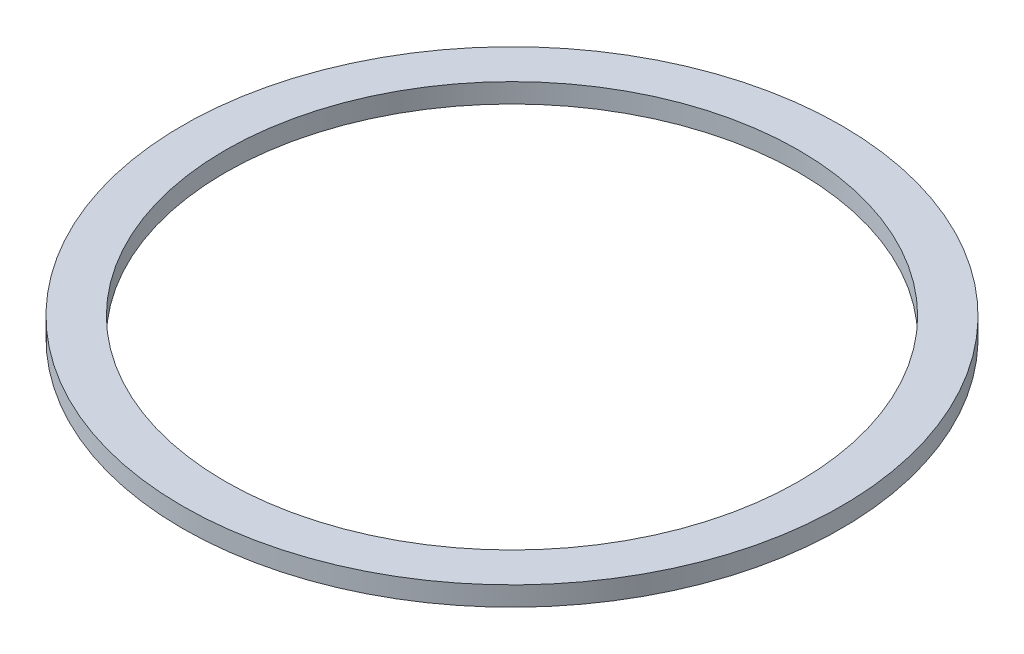
ISO-10303-21;
HEADER;
FILE_DESCRIPTION(('STEP AP214'),'2;1');
FILE_NAME('part.step','',(''),(''),'','','');
FILE_SCHEMA(('AUTOMOTIVE_DESIGN { 1 0 10303 214 1 1 1 1 }'));
ENDSEC;
DATA;
#1=APPLICATION_CONTEXT('core data for automotive mechanical design processes');
#2=APPLICATION_PROTOCOL_DEFINITION('international standard','automotive_design',2000,#1);
#3=PRODUCT_CONTEXT('',#1,'mechanical');
#4=PRODUCT('Part','Part','',(#3));
#5=PRODUCT_RELATED_PRODUCT_CATEGORY('part','',(#4));
#6=PRODUCT_DEFINITION_FORMATION('','',#4);
#7=PRODUCT_DEFINITION_CONTEXT('part definition',#1,'design');
#8=PRODUCT_DEFINITION('design','',#6,#7);
#9=PRODUCT_DEFINITION_SHAPE('','',#8);
#10=(LENGTH_UNIT() NAMED_UNIT(*) SI_UNIT(.MILLI.,.METRE.));
#11=(NAMED_UNIT(*) PLANE_ANGLE_UNIT() SI_UNIT($,.RADIAN.));
#12=(NAMED_UNIT(*) SI_UNIT($,.STERADIAN.) SOLID_ANGLE_UNIT());
#13=UNCERTAINTY_MEASURE_WITH_UNIT(LENGTH_MEASURE(1.E-05),#10,'distance_accuracy_value','');
#14=(GEOMETRIC_REPRESENTATION_CONTEXT(3) GLOBAL_UNCERTAINTY_ASSIGNED_CONTEXT((#13)) GLOBAL_UNIT_ASSIGNED_CONTEXT((#10,
#11,#12)) REPRESENTATION_CONTEXT('',''));
#15=CARTESIAN_POINT('',(0.,0.,0.));
#16=DIRECTION('',(0.,0.,1.));
#17=DIRECTION('',(1.,0.,0.));
#18=AXIS2_PLACEMENT_3D('',#15,#16,#17);
#19=CARTESIAN_POINT('',(0.,1.5875,0.));
#20=DIRECTION('',(0.,1.,0.));
#21=DIRECTION('',(0.,0.,1.));
#22=AXIS2_PLACEMENT_3D('',#19,#20,#21);
#23=PLANE('',#22);
#24=CARTESIAN_POINT('',(0.,1.5875,0.));
#25=DIRECTION('',(0.,1.,0.));
#26=DIRECTION('',(0.,0.,1.));
#27=AXIS2_PLACEMENT_3D('',#24,#25,#26);
#28=CIRCLE('',#27,27.);
#29=CARTESIAN_POINT('',(0.,1.5875,27.));
#30=VERTEX_POINT('',#29);
#31=EDGE_CURVE('E10',#30,#30,#28,.T.);
#32=ORIENTED_EDGE('',*,*,#31,.T.);
#33=EDGE_LOOP('',(#32));
#34=FACE_BOUND('',#33,.T.);
#35=CARTESIAN_POINT('',(0.,1.5875,0.));
#36=DIRECTION('',(0.,1.,0.));
#37=DIRECTION('',(0.,0.,1.));
#38=AXIS2_PLACEMENT_3D('',#35,#36,#37);
#39=CIRCLE('',#38,23.5);
#40=CARTESIAN_POINT('',(0.,1.5875,23.5));
#41=VERTEX_POINT('',#40);
#42=EDGE_CURVE('E42',#41,#41,#39,.T.);
#43=ORIENTED_EDGE('',*,*,#42,.F.);
#44=EDGE_LOOP('',(#43));
#45=FACE_BOUND('',#44,.T.);
#46=ADVANCED_FACE('F31',(#34,#45),#23,.T.);
#47=CARTESIAN_POINT('',(0.,0.,0.));
#48=DIRECTION('',(0.,1.,0.));
#49=DIRECTION('',(0.,0.,1.));
#50=AXIS2_PLACEMENT_3D('',#47,#48,#49);
#51=PLANE('',#50);
#52=CARTESIAN_POINT('',(0.,0.,0.));
#53=DIRECTION('',(0.,1.,0.));
#54=DIRECTION('',(0.,0.,1.));
#55=AXIS2_PLACEMENT_3D('',#52,#53,#54);
#56=CIRCLE('',#55,27.);
#57=CARTESIAN_POINT('',(0.,0.,27.));
#58=VERTEX_POINT('',#57);
#59=EDGE_CURVE('E35',#58,#58,#56,.T.);
#60=ORIENTED_EDGE('',*,*,#59,.F.);
#61=EDGE_LOOP('',(#60));
#62=FACE_BOUND('',#61,.T.);
#63=CARTESIAN_POINT('',(0.,0.,0.));
#64=DIRECTION('',(0.,1.,0.));
#65=DIRECTION('',(0.,0.,1.));
#66=AXIS2_PLACEMENT_3D('',#63,#64,#65);
#67=CIRCLE('',#66,23.5);
#68=CARTESIAN_POINT('',(0.,0.,23.5));
#69=VERTEX_POINT('',#68);
#70=EDGE_CURVE('E44',#69,#69,#67,.T.);
#71=ORIENTED_EDGE('',*,*,#70,.T.);
#72=EDGE_LOOP('',(#71));
#73=FACE_BOUND('',#72,.T.);
#74=ADVANCED_FACE('F54',(#62,#73),#51,.F.);
#75=CARTESIAN_POINT('',(0.,1.5875,0.));
#76=DIRECTION('',(0.,-1.,0.));
#77=DIRECTION('',(0.,0.,-1.));
#78=AXIS2_PLACEMENT_3D('',#75,#76,#77);
#79=CYLINDRICAL_SURFACE('',#78,27.);
#80=ORIENTED_EDGE('',*,*,#31,.F.);
#81=EDGE_LOOP('',(#80));
#82=FACE_BOUND('',#81,.T.);
#83=ORIENTED_EDGE('',*,*,#59,.T.);
#84=EDGE_LOOP('',(#83));
#85=FACE_BOUND('',#84,.T.);
#86=ADVANCED_FACE('F33',(#82,#85),#79,.T.);
#87=CARTESIAN_POINT('',(0.,1.5875,0.));
#88=DIRECTION('',(0.,-1.,0.));
#89=DIRECTION('',(0.,0.,-1.));
#90=AXIS2_PLACEMENT_3D('',#87,#88,#89);
#91=CYLINDRICAL_SURFACE('',#90,23.5);
#92=ORIENTED_EDGE('',*,*,#42,.T.);
#93=EDGE_LOOP('',(#92));
#94=FACE_BOUND('',#93,.T.);
#95=ORIENTED_EDGE('',*,*,#70,.F.);
#96=EDGE_LOOP('',(#95));
#97=FACE_BOUND('',#96,.T.);
#98=ADVANCED_FACE('F50',(#94,#97),#91,.F.);
#99=CLOSED_SHELL('',(#46,#74,#86,#98));
#100=MANIFOLD_SOLID_BREP('B2',#99);
#101=ADVANCED_BREP_SHAPE_REPRESENTATION('',(#18,#100),#14);
#102=SHAPE_DEFINITION_REPRESENTATION(#9,#101);
ENDSEC;
END-ISO-10303-21;
